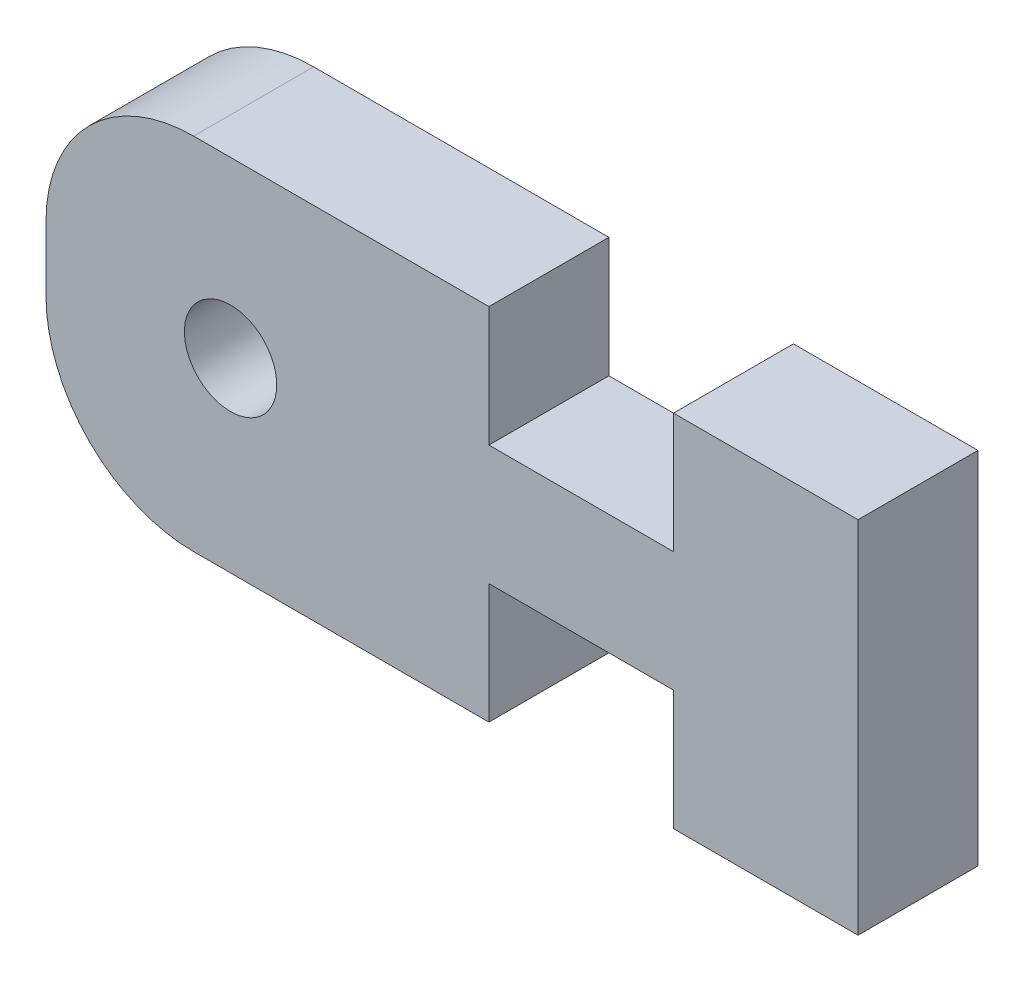
ISO-10303-21;
HEADER;
FILE_DESCRIPTION(('STEP AP214'),'2;1');
FILE_NAME('part.step','',(''),(''),'','','');
FILE_SCHEMA(('AUTOMOTIVE_DESIGN { 1 0 10303 214 1 1 1 1 }'));
ENDSEC;
DATA;
#1=APPLICATION_CONTEXT('core data for automotive mechanical design processes');
#2=APPLICATION_PROTOCOL_DEFINITION('international standard','automotive_design',2000,#1);
#3=PRODUCT_CONTEXT('',#1,'mechanical');
#4=PRODUCT('Part','Part','',(#3));
#5=PRODUCT_RELATED_PRODUCT_CATEGORY('part','',(#4));
#6=PRODUCT_DEFINITION_FORMATION('','',#4);
#7=PRODUCT_DEFINITION_CONTEXT('part definition',#1,'design');
#8=PRODUCT_DEFINITION('design','',#6,#7);
#9=PRODUCT_DEFINITION_SHAPE('','',#8);
#10=(LENGTH_UNIT() NAMED_UNIT(*) SI_UNIT(.MILLI.,.METRE.));
#11=(NAMED_UNIT(*) PLANE_ANGLE_UNIT() SI_UNIT($,.RADIAN.));
#12=(NAMED_UNIT(*) SI_UNIT($,.STERADIAN.) SOLID_ANGLE_UNIT());
#13=UNCERTAINTY_MEASURE_WITH_UNIT(LENGTH_MEASURE(1.E-05),#10,'distance_accuracy_value','');
#14=(GEOMETRIC_REPRESENTATION_CONTEXT(3) GLOBAL_UNCERTAINTY_ASSIGNED_CONTEXT((#13)) GLOBAL_UNIT_ASSIGNED_CONTEXT((#10,
#11,#12)) REPRESENTATION_CONTEXT('',''));
#15=CARTESIAN_POINT('',(0.,0.,0.));
#16=DIRECTION('',(0.,0.,1.));
#17=DIRECTION('',(1.,0.,0.));
#18=AXIS2_PLACEMENT_3D('',#15,#16,#17);
#19=CARTESIAN_POINT('',(0.,0.,6.5));
#20=DIRECTION('',(0.,1.,0.));
#21=DIRECTION('',(0.,0.,1.));
#22=AXIS2_PLACEMENT_3D('',#19,#20,#21);
#23=PLANE('',#22);
#24=DIRECTION('',(1.,0.,0.));
#25=VECTOR('',#24,1.);
#26=CARTESIAN_POINT('',(0.,0.,6.5));
#27=LINE('',#26,#25);
#28=CARTESIAN_POINT('',(34.,0.,6.5));
#29=VERTEX_POINT('',#28);
#30=CARTESIAN_POINT('',(44.,0.,6.5));
#31=VERTEX_POINT('',#30);
#32=EDGE_CURVE('E213',#29,#31,#27,.T.);
#33=ORIENTED_EDGE('',*,*,#32,.F.);
#34=DIRECTION('',(0.,0.,1.));
#35=VECTOR('',#34,1.);
#36=CARTESIAN_POINT('',(34.,0.,-0.00100000000000013));
#37=LINE('',#36,#35);
#38=CARTESIAN_POINT('',(34.,0.,0.));
#39=VERTEX_POINT('',#38);
#40=EDGE_CURVE('E157',#39,#29,#37,.T.);
#41=ORIENTED_EDGE('',*,*,#40,.F.);
#42=DIRECTION('',(1.,0.,0.));
#43=VECTOR('',#42,1.);
#44=CARTESIAN_POINT('',(0.,0.,0.));
#45=LINE('',#44,#43);
#46=CARTESIAN_POINT('',(44.,0.,0.));
#47=VERTEX_POINT('',#46);
#48=EDGE_CURVE('E147',#39,#47,#45,.T.);
#49=ORIENTED_EDGE('',*,*,#48,.T.);
#50=DIRECTION('',(0.,0.,-1.));
#51=VECTOR('',#50,1.);
#52=CARTESIAN_POINT('',(44.,0.,6.5));
#53=LINE('',#52,#51);
#54=EDGE_CURVE('E231',#31,#47,#53,.T.);
#55=ORIENTED_EDGE('',*,*,#54,.F.);
#56=EDGE_LOOP('',(#33,#41,#49,#55));
#57=FACE_BOUND('',#56,.T.);
#58=ADVANCED_FACE('F33',(#57),#23,.F.);
#59=CARTESIAN_POINT('',(0.,19.5,6.5));
#60=DIRECTION('',(0.,-1.,0.));
#61=DIRECTION('',(0.,0.,-1.));
#62=AXIS2_PLACEMENT_3D('',#59,#60,#61);
#63=PLANE('',#62);
#64=DIRECTION('',(-1.,0.,0.));
#65=VECTOR('',#64,1.);
#66=CARTESIAN_POINT('',(0.,19.5,0.));
#67=LINE('',#66,#65);
#68=CARTESIAN_POINT('',(44.,19.5,0.));
#69=VERTEX_POINT('',#68);
#70=CARTESIAN_POINT('',(34.,19.5,0.));
#71=VERTEX_POINT('',#70);
#72=EDGE_CURVE('E214',#69,#71,#67,.T.);
#73=ORIENTED_EDGE('',*,*,#72,.T.);
#74=DIRECTION('',(0.,0.,1.));
#75=VECTOR('',#74,1.);
#76=CARTESIAN_POINT('',(34.,19.5,-0.00100000000000013));
#77=LINE('',#76,#75);
#78=CARTESIAN_POINT('',(34.,19.5,6.5));
#79=VERTEX_POINT('',#78);
#80=EDGE_CURVE('E201',#71,#79,#77,.T.);
#81=ORIENTED_EDGE('',*,*,#80,.T.);
#82=DIRECTION('',(-1.,0.,0.));
#83=VECTOR('',#82,1.);
#84=CARTESIAN_POINT('',(0.,19.5,6.5));
#85=LINE('',#84,#83);
#86=CARTESIAN_POINT('',(44.,19.5,6.5));
#87=VERTEX_POINT('',#86);
#88=EDGE_CURVE('E220',#87,#79,#85,.T.);
#89=ORIENTED_EDGE('',*,*,#88,.F.);
#90=DIRECTION('',(0.,0.,-1.));
#91=VECTOR('',#90,1.);
#92=CARTESIAN_POINT('',(44.,19.5,6.5));
#93=LINE('',#92,#91);
#94=EDGE_CURVE('E223',#87,#69,#93,.T.);
#95=ORIENTED_EDGE('',*,*,#94,.T.);
#96=EDGE_LOOP('',(#73,#81,#89,#95));
#97=FACE_BOUND('',#96,.T.);
#98=ADVANCED_FACE('F270',(#97),#63,.F.);
#99=CARTESIAN_POINT('',(0.,0.,6.5));
#100=DIRECTION('',(1.,0.,0.));
#101=DIRECTION('',(0.,0.,-1.));
#102=AXIS2_PLACEMENT_3D('',#99,#100,#101);
#103=PLANE('',#102);
#104=DIRECTION('',(0.,-1.,0.));
#105=VECTOR('',#104,1.);
#106=CARTESIAN_POINT('',(0.,0.,0.));
#107=LINE('',#106,#105);
#108=CARTESIAN_POINT('',(0.,11.5,0.));
#109=VERTEX_POINT('',#108);
#110=CARTESIAN_POINT('',(0.,8.,0.));
#111=VERTEX_POINT('',#110);
#112=EDGE_CURVE('E204',#109,#111,#107,.T.);
#113=ORIENTED_EDGE('',*,*,#112,.T.);
#114=DIRECTION('',(0.,0.,-1.));
#115=VECTOR('',#114,1.);
#116=CARTESIAN_POINT('',(0.,8.,6.5));
#117=LINE('',#116,#115);
#118=CARTESIAN_POINT('',(0.,8.,6.5));
#119=VERTEX_POINT('',#118);
#120=EDGE_CURVE('E54',#111,#119,#117,.F.);
#121=ORIENTED_EDGE('',*,*,#120,.T.);
#122=DIRECTION('',(0.,-1.,0.));
#123=VECTOR('',#122,1.);
#124=CARTESIAN_POINT('',(0.,0.,6.5));
#125=LINE('',#124,#123);
#126=CARTESIAN_POINT('',(0.,11.5,6.5));
#127=VERTEX_POINT('',#126);
#128=EDGE_CURVE('E211',#127,#119,#125,.T.);
#129=ORIENTED_EDGE('',*,*,#128,.F.);
#130=DIRECTION('',(0.,0.,-1.));
#131=VECTOR('',#130,1.);
#132=CARTESIAN_POINT('',(0.,11.5,6.5));
#133=LINE('',#132,#131);
#134=EDGE_CURVE('E239',#127,#109,#133,.T.);
#135=ORIENTED_EDGE('',*,*,#134,.T.);
#136=EDGE_LOOP('',(#113,#121,#129,#135));
#137=FACE_BOUND('',#136,.T.);
#138=ADVANCED_FACE('F250',(#137),#103,.F.);
#139=CARTESIAN_POINT('',(8.,0.,6.5));
#140=VERTEX_POINT('',#139);
#141=CARTESIAN_POINT('',(24.,0.,6.5));
#142=VERTEX_POINT('',#141);
#143=EDGE_CURVE('E215',#140,#142,#27,.T.);
#144=ORIENTED_EDGE('',*,*,#143,.F.);
#145=DIRECTION('',(0.,0.,-1.));
#146=VECTOR('',#145,1.);
#147=CARTESIAN_POINT('',(8.,0.,6.5));
#148=LINE('',#147,#146);
#149=CARTESIAN_POINT('',(8.,0.,0.));
#150=VERTEX_POINT('',#149);
#151=EDGE_CURVE('E143',#140,#150,#148,.T.);
#152=ORIENTED_EDGE('',*,*,#151,.T.);
#153=CARTESIAN_POINT('',(24.,0.,0.));
#154=VERTEX_POINT('',#153);
#155=EDGE_CURVE('E137',#150,#154,#45,.T.);
#156=ORIENTED_EDGE('',*,*,#155,.T.);
#157=DIRECTION('',(0.,0.,1.));
#158=VECTOR('',#157,1.);
#159=CARTESIAN_POINT('',(24.,0.,-0.00100000000000013));
#160=LINE('',#159,#158);
#161=EDGE_CURVE('E141',#154,#142,#160,.T.);
#162=ORIENTED_EDGE('',*,*,#161,.T.);
#163=EDGE_LOOP('',(#144,#152,#156,#162));
#164=FACE_BOUND('',#163,.T.);
#165=ADVANCED_FACE('F140',(#164),#23,.F.);
#166=CARTESIAN_POINT('',(44.,0.,6.5));
#167=DIRECTION('',(-1.,0.,0.));
#168=DIRECTION('',(0.,-1.,0.));
#169=AXIS2_PLACEMENT_3D('',#166,#167,#168);
#170=PLANE('',#169);
#171=DIRECTION('',(0.,1.,0.));
#172=VECTOR('',#171,1.);
#173=CARTESIAN_POINT('',(44.,0.,0.));
#174=LINE('',#173,#172);
#175=EDGE_CURVE('E146',#47,#69,#174,.T.);
#176=ORIENTED_EDGE('',*,*,#175,.T.);
#177=ORIENTED_EDGE('',*,*,#94,.F.);
#178=DIRECTION('',(0.,1.,0.));
#179=VECTOR('',#178,1.);
#180=CARTESIAN_POINT('',(44.,0.,6.5));
#181=LINE('',#180,#179);
#182=EDGE_CURVE('E217',#31,#87,#181,.T.);
#183=ORIENTED_EDGE('',*,*,#182,.F.);
#184=ORIENTED_EDGE('',*,*,#54,.T.);
#185=EDGE_LOOP('',(#176,#177,#183,#184));
#186=FACE_BOUND('',#185,.T.);
#187=ADVANCED_FACE('F275',(#186),#170,.F.);
#188=CARTESIAN_POINT('',(24.,19.5,0.));
#189=VERTEX_POINT('',#188);
#190=CARTESIAN_POINT('',(8.,19.5,0.));
#191=VERTEX_POINT('',#190);
#192=EDGE_CURVE('E226',#189,#191,#67,.T.);
#193=ORIENTED_EDGE('',*,*,#192,.T.);
#194=DIRECTION('',(0.,0.,-1.));
#195=VECTOR('',#194,1.);
#196=CARTESIAN_POINT('',(8.,19.5,6.5));
#197=LINE('',#196,#195);
#198=CARTESIAN_POINT('',(8.,19.5,6.5));
#199=VERTEX_POINT('',#198);
#200=EDGE_CURVE('E11',#191,#199,#197,.F.);
#201=ORIENTED_EDGE('',*,*,#200,.T.);
#202=CARTESIAN_POINT('',(24.,19.5,6.5));
#203=VERTEX_POINT('',#202);
#204=EDGE_CURVE('E219',#203,#199,#85,.T.);
#205=ORIENTED_EDGE('',*,*,#204,.F.);
#206=DIRECTION('',(0.,0.,1.));
#207=VECTOR('',#206,1.);
#208=CARTESIAN_POINT('',(24.,19.5,-0.00100000000000013));
#209=LINE('',#208,#207);
#210=EDGE_CURVE('E207',#189,#203,#209,.T.);
#211=ORIENTED_EDGE('',*,*,#210,.F.);
#212=EDGE_LOOP('',(#193,#201,#205,#211));
#213=FACE_BOUND('',#212,.T.);
#214=ADVANCED_FACE('F256',(#213),#63,.F.);
#215=CARTESIAN_POINT('',(0.,0.,6.5));
#216=DIRECTION('',(0.,0.,-1.));
#217=DIRECTION('',(-1.,0.,0.));
#218=AXIS2_PLACEMENT_3D('',#215,#216,#217);
#219=PLANE('',#218);
#220=CARTESIAN_POINT('',(10.,10.0729448961157,6.5));
#221=DIRECTION('',(0.,0.,1.));
#222=DIRECTION('',(1.,0.,0.));
#223=AXIS2_PLACEMENT_3D('',#220,#221,#222);
#224=CIRCLE('',#223,2.5);
#225=CARTESIAN_POINT('',(12.5,10.0729448961157,6.5));
#226=VERTEX_POINT('',#225);
#227=EDGE_CURVE('E164',#226,#226,#224,.T.);
#228=ORIENTED_EDGE('',*,*,#227,.F.);
#229=EDGE_LOOP('',(#228));
#230=FACE_BOUND('',#229,.T.);
#231=ORIENTED_EDGE('',*,*,#128,.T.);
#232=CARTESIAN_POINT('',(8.,8.,6.5));
#233=DIRECTION('',(0.,0.,-1.));
#234=DIRECTION('',(-1.,0.,0.));
#235=AXIS2_PLACEMENT_3D('',#232,#233,#234);
#236=CIRCLE('',#235,8.);
#237=EDGE_CURVE('E41',#119,#140,#236,.F.);
#238=ORIENTED_EDGE('',*,*,#237,.T.);
#239=ORIENTED_EDGE('',*,*,#143,.T.);
#240=DIRECTION('',(0.,-1.,0.));
#241=VECTOR('',#240,1.);
#242=CARTESIAN_POINT('',(24.,0.,6.5));
#243=LINE('',#242,#241);
#244=CARTESIAN_POINT('',(24.,6.5,6.5));
#245=VERTEX_POINT('',#244);
#246=EDGE_CURVE('E156',#245,#142,#243,.T.);
#247=ORIENTED_EDGE('',*,*,#246,.F.);
#248=DIRECTION('',(-1.,0.,0.));
#249=VECTOR('',#248,1.);
#250=CARTESIAN_POINT('',(34.,6.5,6.5));
#251=LINE('',#250,#249);
#252=CARTESIAN_POINT('',(34.,6.5,6.5));
#253=VERTEX_POINT('',#252);
#254=EDGE_CURVE('E175',#253,#245,#251,.T.);
#255=ORIENTED_EDGE('',*,*,#254,.F.);
#256=DIRECTION('',(0.,1.,0.));
#257=VECTOR('',#256,1.);
#258=CARTESIAN_POINT('',(34.,0.,6.5));
#259=LINE('',#258,#257);
#260=EDGE_CURVE('E166',#29,#253,#259,.T.);
#261=ORIENTED_EDGE('',*,*,#260,.F.);
#262=ORIENTED_EDGE('',*,*,#32,.T.);
#263=ORIENTED_EDGE('',*,*,#182,.T.);
#264=ORIENTED_EDGE('',*,*,#88,.T.);
#265=DIRECTION('',(0.,1.,0.));
#266=VECTOR('',#265,1.);
#267=CARTESIAN_POINT('',(34.,19.5,6.5));
#268=LINE('',#267,#266);
#269=CARTESIAN_POINT('',(34.,13.,6.5));
#270=VERTEX_POINT('',#269);
#271=EDGE_CURVE('E193',#270,#79,#268,.T.);
#272=ORIENTED_EDGE('',*,*,#271,.F.);
#273=DIRECTION('',(1.,0.,0.));
#274=VECTOR('',#273,1.);
#275=CARTESIAN_POINT('',(34.,13.,6.5));
#276=LINE('',#275,#274);
#277=CARTESIAN_POINT('',(24.,13.,6.5));
#278=VERTEX_POINT('',#277);
#279=EDGE_CURVE('E198',#278,#270,#276,.T.);
#280=ORIENTED_EDGE('',*,*,#279,.F.);
#281=DIRECTION('',(0.,-1.,0.));
#282=VECTOR('',#281,1.);
#283=CARTESIAN_POINT('',(24.,19.5,6.5));
#284=LINE('',#283,#282);
#285=EDGE_CURVE('E195',#203,#278,#284,.T.);
#286=ORIENTED_EDGE('',*,*,#285,.F.);
#287=ORIENTED_EDGE('',*,*,#204,.T.);
#288=CARTESIAN_POINT('',(8.,11.5,6.5));
#289=DIRECTION('',(0.,0.,-1.));
#290=DIRECTION('',(-1.,0.,0.));
#291=AXIS2_PLACEMENT_3D('',#288,#289,#290);
#292=CIRCLE('',#291,8.);
#293=EDGE_CURVE('E243',#199,#127,#292,.F.);
#294=ORIENTED_EDGE('',*,*,#293,.T.);
#295=EDGE_LOOP('',(#231,#238,#239,#247,#255,#261,#262,#263,#264,#272,#280,#286,#287,#294));
#296=FACE_BOUND('',#295,.T.);
#297=ADVANCED_FACE('F246',(#230,#296),#219,.F.);
#298=CARTESIAN_POINT('',(0.,0.,0.));
#299=DIRECTION('',(0.,0.,-1.));
#300=DIRECTION('',(-1.,0.,0.));
#301=AXIS2_PLACEMENT_3D('',#298,#299,#300);
#302=PLANE('',#301);
#303=CARTESIAN_POINT('',(10.,10.0729448961157,0.));
#304=DIRECTION('',(0.,0.,-1.));
#305=DIRECTION('',(-1.,0.,0.));
#306=AXIS2_PLACEMENT_3D('',#303,#304,#305);
#307=CIRCLE('',#306,2.5);
#308=CARTESIAN_POINT('',(12.5,10.0729448961157,0.));
#309=VERTEX_POINT('',#308);
#310=EDGE_CURVE('E169',#309,#309,#307,.F.);
#311=ORIENTED_EDGE('',*,*,#310,.T.);
#312=EDGE_LOOP('',(#311));
#313=FACE_BOUND('',#312,.T.);
#314=ORIENTED_EDGE('',*,*,#155,.F.);
#315=CARTESIAN_POINT('',(8.,8.,0.));
#316=DIRECTION('',(0.,0.,-1.));
#317=DIRECTION('',(-1.,0.,0.));
#318=AXIS2_PLACEMENT_3D('',#315,#316,#317);
#319=CIRCLE('',#318,8.);
#320=EDGE_CURVE('E237',#150,#111,#319,.T.);
#321=ORIENTED_EDGE('',*,*,#320,.T.);
#322=ORIENTED_EDGE('',*,*,#112,.F.);
#323=CARTESIAN_POINT('',(8.,11.5,0.));
#324=DIRECTION('',(0.,0.,-1.));
#325=DIRECTION('',(-1.,0.,0.));
#326=AXIS2_PLACEMENT_3D('',#323,#324,#325);
#327=CIRCLE('',#326,8.);
#328=EDGE_CURVE('E235',#109,#191,#327,.T.);
#329=ORIENTED_EDGE('',*,*,#328,.T.);
#330=ORIENTED_EDGE('',*,*,#192,.F.);
#331=DIRECTION('',(0.,-1.,0.));
#332=VECTOR('',#331,1.);
#333=CARTESIAN_POINT('',(24.,19.5,0.));
#334=LINE('',#333,#332);
#335=CARTESIAN_POINT('',(24.,13.,0.));
#336=VERTEX_POINT('',#335);
#337=EDGE_CURVE('E184',#189,#336,#334,.T.);
#338=ORIENTED_EDGE('',*,*,#337,.T.);
#339=DIRECTION('',(1.,0.,0.));
#340=VECTOR('',#339,1.);
#341=CARTESIAN_POINT('',(34.,13.,0.));
#342=LINE('',#341,#340);
#343=CARTESIAN_POINT('',(34.,13.,0.));
#344=VERTEX_POINT('',#343);
#345=EDGE_CURVE('E187',#336,#344,#342,.T.);
#346=ORIENTED_EDGE('',*,*,#345,.T.);
#347=DIRECTION('',(0.,1.,0.));
#348=VECTOR('',#347,1.);
#349=CARTESIAN_POINT('',(34.,19.5,0.));
#350=LINE('',#349,#348);
#351=EDGE_CURVE('E190',#344,#71,#350,.T.);
#352=ORIENTED_EDGE('',*,*,#351,.T.);
#353=ORIENTED_EDGE('',*,*,#72,.F.);
#354=ORIENTED_EDGE('',*,*,#175,.F.);
#355=ORIENTED_EDGE('',*,*,#48,.F.);
#356=DIRECTION('',(0.,1.,0.));
#357=VECTOR('',#356,1.);
#358=CARTESIAN_POINT('',(34.,0.,0.));
#359=LINE('',#358,#357);
#360=CARTESIAN_POINT('',(34.,6.5,0.));
#361=VERTEX_POINT('',#360);
#362=EDGE_CURVE('E163',#39,#361,#359,.T.);
#363=ORIENTED_EDGE('',*,*,#362,.T.);
#364=DIRECTION('',(-1.,0.,0.));
#365=VECTOR('',#364,1.);
#366=CARTESIAN_POINT('',(34.,6.5,0.));
#367=LINE('',#366,#365);
#368=CARTESIAN_POINT('',(24.,6.5,0.));
#369=VERTEX_POINT('',#368);
#370=EDGE_CURVE('E162',#361,#369,#367,.T.);
#371=ORIENTED_EDGE('',*,*,#370,.T.);
#372=DIRECTION('',(0.,-1.,0.));
#373=VECTOR('',#372,1.);
#374=CARTESIAN_POINT('',(24.,0.,0.));
#375=LINE('',#374,#373);
#376=EDGE_CURVE('E153',#369,#154,#375,.T.);
#377=ORIENTED_EDGE('',*,*,#376,.T.);
#378=EDGE_LOOP('',(#314,#321,#322,#329,#330,#338,#346,#352,#353,#354,#355,#363,#371,#377));
#379=FACE_BOUND('',#378,.T.);
#380=ADVANCED_FACE('F160',(#313,#379),#302,.T.);
#381=CARTESIAN_POINT('',(34.,19.5,-0.00100000000000013));
#382=DIRECTION('',(1.,0.,0.));
#383=DIRECTION('',(0.,0.,-1.));
#384=AXIS2_PLACEMENT_3D('',#381,#382,#383);
#385=PLANE('',#384);
#386=DIRECTION('',(0.,0.,1.));
#387=VECTOR('',#386,1.);
#388=CARTESIAN_POINT('',(34.,13.,-0.00100000000000013));
#389=LINE('',#388,#387);
#390=EDGE_CURVE('E202',#344,#270,#389,.T.);
#391=ORIENTED_EDGE('',*,*,#390,.T.);
#392=ORIENTED_EDGE('',*,*,#271,.T.);
#393=ORIENTED_EDGE('',*,*,#80,.F.);
#394=ORIENTED_EDGE('',*,*,#351,.F.);
#395=EDGE_LOOP('',(#391,#392,#393,#394));
#396=FACE_BOUND('',#395,.T.);
#397=ADVANCED_FACE('F324',(#396),#385,.F.);
#398=CARTESIAN_POINT('',(34.,13.,-0.00100000000000013));
#399=DIRECTION('',(0.,-1.,0.));
#400=DIRECTION('',(1.,0.,0.));
#401=AXIS2_PLACEMENT_3D('',#398,#399,#400);
#402=PLANE('',#401);
#403=DIRECTION('',(0.,0.,1.));
#404=VECTOR('',#403,1.);
#405=CARTESIAN_POINT('',(24.,13.,-0.00100000000000013));
#406=LINE('',#405,#404);
#407=EDGE_CURVE('E205',#336,#278,#406,.T.);
#408=ORIENTED_EDGE('',*,*,#407,.T.);
#409=ORIENTED_EDGE('',*,*,#279,.T.);
#410=ORIENTED_EDGE('',*,*,#390,.F.);
#411=ORIENTED_EDGE('',*,*,#345,.F.);
#412=EDGE_LOOP('',(#408,#409,#410,#411));
#413=FACE_BOUND('',#412,.T.);
#414=ADVANCED_FACE('F264',(#413),#402,.F.);
#415=CARTESIAN_POINT('',(24.,19.5,-0.00100000000000013));
#416=DIRECTION('',(-1.,0.,0.));
#417=DIRECTION('',(0.,0.,1.));
#418=AXIS2_PLACEMENT_3D('',#415,#416,#417);
#419=PLANE('',#418);
#420=ORIENTED_EDGE('',*,*,#210,.T.);
#421=ORIENTED_EDGE('',*,*,#285,.T.);
#422=ORIENTED_EDGE('',*,*,#407,.F.);
#423=ORIENTED_EDGE('',*,*,#337,.F.);
#424=EDGE_LOOP('',(#420,#421,#422,#423));
#425=FACE_BOUND('',#424,.T.);
#426=ADVANCED_FACE('F259',(#425),#419,.F.);
#427=CARTESIAN_POINT('',(34.,0.,-0.00100000000000013));
#428=DIRECTION('',(1.,0.,0.));
#429=DIRECTION('',(0.,0.,-1.));
#430=AXIS2_PLACEMENT_3D('',#427,#428,#429);
#431=PLANE('',#430);
#432=ORIENTED_EDGE('',*,*,#40,.T.);
#433=ORIENTED_EDGE('',*,*,#260,.T.);
#434=DIRECTION('',(0.,0.,1.));
#435=VECTOR('',#434,1.);
#436=CARTESIAN_POINT('',(34.,6.5,-0.00100000000000013));
#437=LINE('',#436,#435);
#438=EDGE_CURVE('E179',#361,#253,#437,.T.);
#439=ORIENTED_EDGE('',*,*,#438,.F.);
#440=ORIENTED_EDGE('',*,*,#362,.F.);
#441=EDGE_LOOP('',(#432,#433,#439,#440));
#442=FACE_BOUND('',#441,.T.);
#443=ADVANCED_FACE('F283',(#442),#431,.F.);
#444=CARTESIAN_POINT('',(24.,0.,-0.00100000000000013));
#445=DIRECTION('',(-1.,0.,0.));
#446=DIRECTION('',(0.,0.,1.));
#447=AXIS2_PLACEMENT_3D('',#444,#445,#446);
#448=PLANE('',#447);
#449=DIRECTION('',(0.,0.,1.));
#450=VECTOR('',#449,1.);
#451=CARTESIAN_POINT('',(24.,6.5,-0.00100000000000013));
#452=LINE('',#451,#450);
#453=EDGE_CURVE('E158',#369,#245,#452,.T.);
#454=ORIENTED_EDGE('',*,*,#453,.T.);
#455=ORIENTED_EDGE('',*,*,#246,.T.);
#456=ORIENTED_EDGE('',*,*,#161,.F.);
#457=ORIENTED_EDGE('',*,*,#376,.F.);
#458=EDGE_LOOP('',(#454,#455,#456,#457));
#459=FACE_BOUND('',#458,.T.);
#460=ADVANCED_FACE('F152',(#459),#448,.F.);
#461=CARTESIAN_POINT('',(34.,6.5,-0.00100000000000013));
#462=DIRECTION('',(0.,1.,0.));
#463=DIRECTION('',(-1.,0.,0.));
#464=AXIS2_PLACEMENT_3D('',#461,#462,#463);
#465=PLANE('',#464);
#466=ORIENTED_EDGE('',*,*,#438,.T.);
#467=ORIENTED_EDGE('',*,*,#254,.T.);
#468=ORIENTED_EDGE('',*,*,#453,.F.);
#469=ORIENTED_EDGE('',*,*,#370,.F.);
#470=EDGE_LOOP('',(#466,#467,#468,#469));
#471=FACE_BOUND('',#470,.T.);
#472=ADVANCED_FACE('F287',(#471),#465,.F.);
#473=CARTESIAN_POINT('',(8.,8.,6.5));
#474=DIRECTION('',(0.,0.,-1.));
#475=DIRECTION('',(-1.,0.,0.));
#476=AXIS2_PLACEMENT_3D('',#473,#474,#475);
#477=CYLINDRICAL_SURFACE('',#476,8.);
#478=ORIENTED_EDGE('',*,*,#237,.F.);
#479=ORIENTED_EDGE('',*,*,#120,.F.);
#480=ORIENTED_EDGE('',*,*,#320,.F.);
#481=ORIENTED_EDGE('',*,*,#151,.F.);
#482=EDGE_LOOP('',(#478,#479,#480,#481));
#483=FACE_BOUND('',#482,.T.);
#484=ADVANCED_FACE('F248',(#483),#477,.T.);
#485=CARTESIAN_POINT('',(8.,11.5,6.5));
#486=DIRECTION('',(0.,0.,-1.));
#487=DIRECTION('',(-1.,0.,0.));
#488=AXIS2_PLACEMENT_3D('',#485,#486,#487);
#489=CYLINDRICAL_SURFACE('',#488,8.);
#490=ORIENTED_EDGE('',*,*,#293,.F.);
#491=ORIENTED_EDGE('',*,*,#200,.F.);
#492=ORIENTED_EDGE('',*,*,#328,.F.);
#493=ORIENTED_EDGE('',*,*,#134,.F.);
#494=EDGE_LOOP('',(#490,#491,#492,#493));
#495=FACE_BOUND('',#494,.T.);
#496=ADVANCED_FACE('F35',(#495),#489,.T.);
#497=CARTESIAN_POINT('',(10.,10.0729448961157,-0.00100000000000013));
#498=DIRECTION('',(0.,0.,1.));
#499=DIRECTION('',(1.,0.,0.));
#500=AXIS2_PLACEMENT_3D('',#497,#498,#499);
#501=CYLINDRICAL_SURFACE('',#500,2.5);
#502=CARTESIAN_POINT('',(12.5,10.0729448961157,0.));
#503=CARTESIAN_POINT('',(12.5,10.0729448961157,0.0677083333333333));
#504=CARTESIAN_POINT('',(12.5,10.0729448961157,0.135416666666667));
#505=CARTESIAN_POINT('',(12.5,10.0729448961157,0.270833333333333));
#506=CARTESIAN_POINT('',(12.5,10.0729448961157,0.338541666666667));
#507=CARTESIAN_POINT('',(12.5,10.0729448961157,0.473958333333333));
#508=CARTESIAN_POINT('',(12.5,10.0729448961157,0.541666666666667));
#509=CARTESIAN_POINT('',(12.5,10.0729448961157,0.677083333333333));
#510=CARTESIAN_POINT('',(12.5,10.0729448961157,0.744791666666667));
#511=CARTESIAN_POINT('',(12.5,10.0729448961157,0.880208333333333));
#512=CARTESIAN_POINT('',(12.5,10.0729448961157,0.947916666666666));
#513=CARTESIAN_POINT('',(12.5,10.0729448961157,1.08333333333333));
#514=CARTESIAN_POINT('',(12.5,10.0729448961157,1.15104166666667));
#515=CARTESIAN_POINT('',(12.5,10.0729448961157,1.28645833333333));
#516=CARTESIAN_POINT('',(12.5,10.0729448961157,1.35416666666667));
#517=CARTESIAN_POINT('',(12.5,10.0729448961157,1.48958333333333));
#518=CARTESIAN_POINT('',(12.5,10.0729448961157,1.55729166666667));
#519=CARTESIAN_POINT('',(12.5,10.0729448961157,1.69270833333333));
#520=CARTESIAN_POINT('',(12.5,10.0729448961157,1.76041666666667));
#521=CARTESIAN_POINT('',(12.5,10.0729448961157,1.89583333333333));
#522=CARTESIAN_POINT('',(12.5,10.0729448961157,1.96354166666667));
#523=CARTESIAN_POINT('',(12.5,10.0729448961157,2.09895833333333));
#524=CARTESIAN_POINT('',(12.5,10.0729448961157,2.16666666666667));
#525=CARTESIAN_POINT('',(12.5,10.0729448961157,2.30208333333333));
#526=CARTESIAN_POINT('',(12.5,10.0729448961157,2.36979166666667));
#527=CARTESIAN_POINT('',(12.5,10.0729448961157,2.50520833333333));
#528=CARTESIAN_POINT('',(12.5,10.0729448961157,2.57291666666667));
#529=CARTESIAN_POINT('',(12.5,10.0729448961157,2.70833333333333));
#530=CARTESIAN_POINT('',(12.5,10.0729448961157,2.77604166666667));
#531=CARTESIAN_POINT('',(12.5,10.0729448961157,2.91145833333333));
#532=CARTESIAN_POINT('',(12.5,10.0729448961157,2.97916666666667));
#533=CARTESIAN_POINT('',(12.5,10.0729448961157,3.11458333333333));
#534=CARTESIAN_POINT('',(12.5,10.0729448961157,3.18229166666667));
#535=CARTESIAN_POINT('',(12.5,10.0729448961157,3.31770833333333));
#536=CARTESIAN_POINT('',(12.5,10.0729448961157,3.38541666666667));
#537=CARTESIAN_POINT('',(12.5,10.0729448961157,3.52083333333333));
#538=CARTESIAN_POINT('',(12.5,10.0729448961157,3.58854166666667));
#539=CARTESIAN_POINT('',(12.5,10.0729448961157,3.72395833333333));
#540=CARTESIAN_POINT('',(12.5,10.0729448961157,3.79166666666667));
#541=CARTESIAN_POINT('',(12.5,10.0729448961157,3.92708333333333));
#542=CARTESIAN_POINT('',(12.5,10.0729448961157,3.99479166666667));
#543=CARTESIAN_POINT('',(12.5,10.0729448961157,4.13020833333333));
#544=CARTESIAN_POINT('',(12.5,10.0729448961157,4.19791666666667));
#545=CARTESIAN_POINT('',(12.5,10.0729448961157,4.33333333333333));
#546=CARTESIAN_POINT('',(12.5,10.0729448961157,4.40104166666667));
#547=CARTESIAN_POINT('',(12.5,10.0729448961157,4.53645833333333));
#548=CARTESIAN_POINT('',(12.5,10.0729448961157,4.60416666666667));
#549=CARTESIAN_POINT('',(12.5,10.0729448961157,4.73958333333333));
#550=CARTESIAN_POINT('',(12.5,10.0729448961157,4.80729166666667));
#551=CARTESIAN_POINT('',(12.5,10.0729448961157,4.94270833333333));
#552=CARTESIAN_POINT('',(12.5,10.0729448961157,5.01041666666667));
#553=CARTESIAN_POINT('',(12.5,10.0729448961157,5.14583333333333));
#554=CARTESIAN_POINT('',(12.5,10.0729448961157,5.21354166666667));
#555=CARTESIAN_POINT('',(12.5,10.0729448961157,5.34895833333333));
#556=CARTESIAN_POINT('',(12.5,10.0729448961157,5.41666666666667));
#557=CARTESIAN_POINT('',(12.5,10.0729448961157,5.55208333333333));
#558=CARTESIAN_POINT('',(12.5,10.0729448961157,5.61979166666667));
#559=CARTESIAN_POINT('',(12.5,10.0729448961157,5.75520833333333));
#560=CARTESIAN_POINT('',(12.5,10.0729448961157,5.82291666666667));
#561=CARTESIAN_POINT('',(12.5,10.0729448961157,5.95833333333333));
#562=CARTESIAN_POINT('',(12.5,10.0729448961157,6.02604166666667));
#563=CARTESIAN_POINT('',(12.5,10.0729448961157,6.16145833333333));
#564=CARTESIAN_POINT('',(12.5,10.0729448961157,6.22916666666667));
#565=CARTESIAN_POINT('',(12.5,10.0729448961157,6.36458333333333));
#566=CARTESIAN_POINT('',(12.5,10.0729448961157,6.43229166666667));
#567=CARTESIAN_POINT('',(12.5,10.0729448961157,6.5));
#568=B_SPLINE_CURVE_WITH_KNOTS('',3,(#502,#503,#504,#505,#506,#507,#508,#509,#510,#511,#512,
#513,#514,#515,#516,#517,#518,#519,#520,#521,#522,#523,#524,#525,#526,#527,#528,#529,#530,#531,
#532,#533,#534,#535,#536,#537,#538,#539,#540,#541,#542,#543,#544,#545,#546,#547,#548,#549,#550,
#551,#552,#553,#554,#555,#556,#557,#558,#559,#560,#561,#562,#563,#564,#565,#566,#567),
.UNSPECIFIED.,.F.,.F.,(4,2,2,2,2,2,2,2,2,2,2,2,2,2,2,2,2,2,2,2,2,2,2,2,2,2,2,2,2,2,2,2,4),(0.,
0.203125,0.40625,0.609375,0.8125,1.015625,1.21875,1.421875,1.625,1.828125,2.03125,2.234375,
2.4375,2.640625,2.84375,3.046875,3.25,3.453125,3.65625,3.859375,4.0625,4.265625,4.46875,
4.671875,4.875,5.078125,5.28125,5.484375,5.6875,5.890625,6.09375,6.296875,6.5),.UNSPECIFIED.);
#569=EDGE_CURVE('BSEAM378',#309,#226,#568,.T.);
#570=ORIENTED_EDGE('',*,*,#310,.F.);
#571=ORIENTED_EDGE('',*,*,#227,.T.);
#572=ORIENTED_EDGE('',*,*,#569,.T.);
#573=ORIENTED_EDGE('',*,*,#569,.F.);
#574=EDGE_LOOP('',(#570,#572,#571,#573));
#575=FACE_BOUND('',#574,.T.);
#576=ADVANCED_FACE('F378',(#575),#501,.F.);
#577=CLOSED_SHELL('',(#58,#98,#138,#165,#187,#214,#297,#380,#397,#414,#426,#443,#460,#472,#484,
#496,#576));
#578=MANIFOLD_SOLID_BREP('B2',#577);
#579=ADVANCED_BREP_SHAPE_REPRESENTATION('',(#18,#578),#14);
#580=SHAPE_DEFINITION_REPRESENTATION(#9,#579);
ENDSEC;
END-ISO-10303-21;
